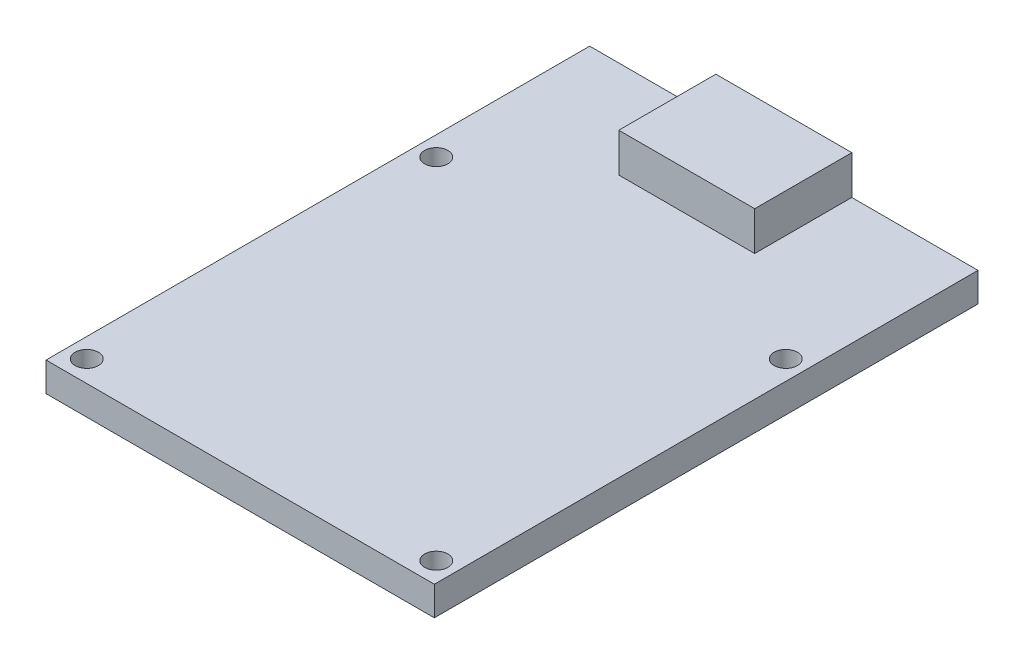
ISO-10303-21;
HEADER;
FILE_DESCRIPTION(('STEP AP214'),'2;1');
FILE_NAME('part.step','',(''),(''),'','','');
FILE_SCHEMA(('AUTOMOTIVE_DESIGN { 1 0 10303 214 1 1 1 1 }'));
ENDSEC;
DATA;
#1=APPLICATION_CONTEXT('core data for automotive mechanical design processes');
#2=APPLICATION_PROTOCOL_DEFINITION('international standard','automotive_design',2000,#1);
#3=PRODUCT_CONTEXT('',#1,'mechanical');
#4=PRODUCT('Part','Part','',(#3));
#5=PRODUCT_RELATED_PRODUCT_CATEGORY('part','',(#4));
#6=PRODUCT_DEFINITION_FORMATION('','',#4);
#7=PRODUCT_DEFINITION_CONTEXT('part definition',#1,'design');
#8=PRODUCT_DEFINITION('design','',#6,#7);
#9=PRODUCT_DEFINITION_SHAPE('','',#8);
#10=(LENGTH_UNIT() NAMED_UNIT(*) SI_UNIT(.MILLI.,.METRE.));
#11=(NAMED_UNIT(*) PLANE_ANGLE_UNIT() SI_UNIT($,.RADIAN.));
#12=(NAMED_UNIT(*) SI_UNIT($,.STERADIAN.) SOLID_ANGLE_UNIT());
#13=UNCERTAINTY_MEASURE_WITH_UNIT(LENGTH_MEASURE(1.E-05),#10,'distance_accuracy_value','');
#14=(GEOMETRIC_REPRESENTATION_CONTEXT(3) GLOBAL_UNCERTAINTY_ASSIGNED_CONTEXT((#13)) GLOBAL_UNIT_ASSIGNED_CONTEXT((#10,
#11,#12)) REPRESENTATION_CONTEXT('',''));
#15=CARTESIAN_POINT('',(0.,0.,0.));
#16=DIRECTION('',(0.,0.,1.));
#17=DIRECTION('',(1.,0.,0.));
#18=AXIS2_PLACEMENT_3D('',#15,#16,#17);
#19=CARTESIAN_POINT('',(0.,3.,0.));
#20=DIRECTION('',(0.,1.,0.));
#21=DIRECTION('',(0.,0.,1.));
#22=AXIS2_PLACEMENT_3D('',#19,#20,#21);
#23=PLANE('',#22);
#24=CARTESIAN_POINT('',(-18.,3.,-10.2));
#25=DIRECTION('',(0.,1.,0.));
#26=DIRECTION('',(0.,0.,1.));
#27=AXIS2_PLACEMENT_3D('',#24,#25,#26);
#28=CIRCLE('',#27,1.20000000000001);
#29=CARTESIAN_POINT('',(-18.,3.,-8.99999999999999));
#30=VERTEX_POINT('',#29);
#31=EDGE_CURVE('E125',#30,#30,#28,.T.);
#32=ORIENTED_EDGE('',*,*,#31,.F.);
#33=EDGE_LOOP('',(#32));
#34=FACE_BOUND('',#33,.T.);
#35=CARTESIAN_POINT('',(18.,3.,-10.2));
#36=DIRECTION('',(0.,1.,0.));
#37=DIRECTION('',(0.,0.,1.));
#38=AXIS2_PLACEMENT_3D('',#35,#36,#37);
#39=CIRCLE('',#38,1.20000000000001);
#40=CARTESIAN_POINT('',(18.,3.,-8.99999999999999));
#41=VERTEX_POINT('',#40);
#42=EDGE_CURVE('E136',#41,#41,#39,.T.);
#43=ORIENTED_EDGE('',*,*,#42,.F.);
#44=EDGE_LOOP('',(#43));
#45=FACE_BOUND('',#44,.T.);
#46=CARTESIAN_POINT('',(18.,3.,25.8));
#47=DIRECTION('',(0.,1.,0.));
#48=DIRECTION('',(0.,0.,1.));
#49=AXIS2_PLACEMENT_3D('',#46,#47,#48);
#50=CIRCLE('',#49,1.20000000000001);
#51=CARTESIAN_POINT('',(18.,3.,27.));
#52=VERTEX_POINT('',#51);
#53=EDGE_CURVE('E142',#52,#52,#50,.T.);
#54=ORIENTED_EDGE('',*,*,#53,.F.);
#55=EDGE_LOOP('',(#54));
#56=FACE_BOUND('',#55,.T.);
#57=CARTESIAN_POINT('',(-18.,3.,25.8));
#58=DIRECTION('',(0.,1.,0.));
#59=DIRECTION('',(0.,0.,1.));
#60=AXIS2_PLACEMENT_3D('',#57,#58,#59);
#61=CIRCLE('',#60,1.20000000000001);
#62=CARTESIAN_POINT('',(-18.,3.,27.));
#63=VERTEX_POINT('',#62);
#64=EDGE_CURVE('E148',#63,#63,#61,.T.);
#65=ORIENTED_EDGE('',*,*,#64,.F.);
#66=EDGE_LOOP('',(#65));
#67=FACE_BOUND('',#66,.T.);
#68=DIRECTION('',(1.,0.,0.));
#69=VECTOR('',#68,1.);
#70=CARTESIAN_POINT('',(0.,3.,-18.));
#71=LINE('',#70,#69);
#72=CARTESIAN_POINT('',(-7.,3.,-18.));
#73=VERTEX_POINT('',#72);
#74=CARTESIAN_POINT('',(7.,3.,-18.));
#75=VERTEX_POINT('',#74);
#76=EDGE_CURVE('E56',#73,#75,#71,.T.);
#77=ORIENTED_EDGE('',*,*,#76,.F.);
#78=DIRECTION('',(0.,0.,-1.));
#79=VECTOR('',#78,1.);
#80=CARTESIAN_POINT('',(-7.,3.,0.));
#81=LINE('',#80,#79);
#82=CARTESIAN_POINT('',(-7.,3.,-28.));
#83=VERTEX_POINT('',#82);
#84=EDGE_CURVE('E122',#73,#83,#81,.T.);
#85=ORIENTED_EDGE('',*,*,#84,.T.);
#86=DIRECTION('',(-1.,0.,0.));
#87=VECTOR('',#86,1.);
#88=CARTESIAN_POINT('',(-20.,3.,-28.));
#89=LINE('',#88,#87);
#90=CARTESIAN_POINT('',(-20.,3.,-28.));
#91=VERTEX_POINT('',#90);
#92=EDGE_CURVE('E158',#83,#91,#89,.T.);
#93=ORIENTED_EDGE('',*,*,#92,.T.);
#94=DIRECTION('',(0.,0.,1.));
#95=VECTOR('',#94,1.);
#96=CARTESIAN_POINT('',(-20.,3.,-28.));
#97=LINE('',#96,#95);
#98=CARTESIAN_POINT('',(-20.,3.,28.));
#99=VERTEX_POINT('',#98);
#100=EDGE_CURVE('E162',#91,#99,#97,.T.);
#101=ORIENTED_EDGE('',*,*,#100,.T.);
#102=DIRECTION('',(1.,0.,0.));
#103=VECTOR('',#102,1.);
#104=CARTESIAN_POINT('',(-20.,3.,28.));
#105=LINE('',#104,#103);
#106=CARTESIAN_POINT('',(20.,3.,28.));
#107=VERTEX_POINT('',#106);
#108=EDGE_CURVE('E164',#99,#107,#105,.T.);
#109=ORIENTED_EDGE('',*,*,#108,.T.);
#110=DIRECTION('',(0.,0.,-1.));
#111=VECTOR('',#110,1.);
#112=CARTESIAN_POINT('',(20.,3.,-28.));
#113=LINE('',#112,#111);
#114=CARTESIAN_POINT('',(20.,3.,-28.));
#115=VERTEX_POINT('',#114);
#116=EDGE_CURVE('E155',#107,#115,#113,.T.);
#117=ORIENTED_EDGE('',*,*,#116,.T.);
#118=CARTESIAN_POINT('',(7.,3.,-28.));
#119=VERTEX_POINT('',#118);
#120=EDGE_CURVE('E160',#115,#119,#89,.T.);
#121=ORIENTED_EDGE('',*,*,#120,.T.);
#122=DIRECTION('',(0.,0.,-1.));
#123=VECTOR('',#122,1.);
#124=CARTESIAN_POINT('',(7.,3.,0.));
#125=LINE('',#124,#123);
#126=EDGE_CURVE('E61',#75,#119,#125,.T.);
#127=ORIENTED_EDGE('',*,*,#126,.F.);
#128=EDGE_LOOP('',(#77,#85,#93,#101,#109,#117,#121,#127));
#129=FACE_BOUND('',#128,.T.);
#130=ADVANCED_FACE('F41',(#34,#45,#56,#67,#129),#23,.T.);
#131=CARTESIAN_POINT('',(20.,3.,-28.));
#132=DIRECTION('',(-1.,0.,0.));
#133=DIRECTION('',(0.,0.,1.));
#134=AXIS2_PLACEMENT_3D('',#131,#132,#133);
#135=PLANE('',#134);
#136=DIRECTION('',(0.,0.,-1.));
#137=VECTOR('',#136,1.);
#138=CARTESIAN_POINT('',(20.,0.,-28.));
#139=LINE('',#138,#137);
#140=CARTESIAN_POINT('',(20.,0.,28.));
#141=VERTEX_POINT('',#140);
#142=CARTESIAN_POINT('',(20.,0.,-28.));
#143=VERTEX_POINT('',#142);
#144=EDGE_CURVE('E154',#141,#143,#139,.T.);
#145=ORIENTED_EDGE('',*,*,#144,.T.);
#146=DIRECTION('',(0.,-1.,0.));
#147=VECTOR('',#146,1.);
#148=CARTESIAN_POINT('',(20.,3.,-28.));
#149=LINE('',#148,#147);
#150=EDGE_CURVE('E11',#115,#143,#149,.T.);
#151=ORIENTED_EDGE('',*,*,#150,.F.);
#152=ORIENTED_EDGE('',*,*,#116,.F.);
#153=DIRECTION('',(0.,-1.,0.));
#154=VECTOR('',#153,1.);
#155=CARTESIAN_POINT('',(20.,3.,28.));
#156=LINE('',#155,#154);
#157=EDGE_CURVE('E166',#107,#141,#156,.T.);
#158=ORIENTED_EDGE('',*,*,#157,.T.);
#159=EDGE_LOOP('',(#145,#151,#152,#158));
#160=FACE_BOUND('',#159,.T.);
#161=ADVANCED_FACE('F43',(#160),#135,.F.);
#162=CARTESIAN_POINT('',(-20.,3.,-28.));
#163=DIRECTION('',(0.,0.,1.));
#164=DIRECTION('',(1.,0.,0.));
#165=AXIS2_PLACEMENT_3D('',#162,#163,#164);
#166=PLANE('',#165);
#167=DIRECTION('',(-1.,0.,0.));
#168=VECTOR('',#167,1.);
#169=CARTESIAN_POINT('',(-20.,0.,-28.));
#170=LINE('',#169,#168);
#171=CARTESIAN_POINT('',(-20.,0.,-28.));
#172=VERTEX_POINT('',#171);
#173=EDGE_CURVE('E169',#143,#172,#170,.T.);
#174=ORIENTED_EDGE('',*,*,#173,.T.);
#175=DIRECTION('',(0.,-1.,0.));
#176=VECTOR('',#175,1.);
#177=CARTESIAN_POINT('',(-20.,3.,-28.));
#178=LINE('',#177,#176);
#179=EDGE_CURVE('E49',#91,#172,#178,.T.);
#180=ORIENTED_EDGE('',*,*,#179,.F.);
#181=ORIENTED_EDGE('',*,*,#92,.F.);
#182=DIRECTION('',(0.,-1.,0.));
#183=VECTOR('',#182,1.);
#184=CARTESIAN_POINT('',(-7.,7.,-28.));
#185=LINE('',#184,#183);
#186=CARTESIAN_POINT('',(-7.,7.,-28.));
#187=VERTEX_POINT('',#186);
#188=EDGE_CURVE('E130',#187,#83,#185,.T.);
#189=ORIENTED_EDGE('',*,*,#188,.F.);
#190=DIRECTION('',(-1.,0.,0.));
#191=VECTOR('',#190,1.);
#192=CARTESIAN_POINT('',(0.,7.,-28.));
#193=LINE('',#192,#191);
#194=CARTESIAN_POINT('',(7.,7.,-28.));
#195=VERTEX_POINT('',#194);
#196=EDGE_CURVE('E113',#195,#187,#193,.T.);
#197=ORIENTED_EDGE('',*,*,#196,.F.);
#198=DIRECTION('',(0.,-1.,0.));
#199=VECTOR('',#198,1.);
#200=CARTESIAN_POINT('',(7.,7.,-28.));
#201=LINE('',#200,#199);
#202=EDGE_CURVE('E110',#195,#119,#201,.T.);
#203=ORIENTED_EDGE('',*,*,#202,.T.);
#204=ORIENTED_EDGE('',*,*,#120,.F.);
#205=ORIENTED_EDGE('',*,*,#150,.T.);
#206=EDGE_LOOP('',(#174,#180,#181,#189,#197,#203,#204,#205));
#207=FACE_BOUND('',#206,.T.);
#208=ADVANCED_FACE('F201',(#207),#166,.F.);
#209=CARTESIAN_POINT('',(-20.,3.,-28.));
#210=DIRECTION('',(1.,0.,0.));
#211=DIRECTION('',(0.,0.,-1.));
#212=AXIS2_PLACEMENT_3D('',#209,#210,#211);
#213=PLANE('',#212);
#214=DIRECTION('',(0.,0.,1.));
#215=VECTOR('',#214,1.);
#216=CARTESIAN_POINT('',(-20.,0.,-28.));
#217=LINE('',#216,#215);
#218=CARTESIAN_POINT('',(-20.,0.,28.));
#219=VERTEX_POINT('',#218);
#220=EDGE_CURVE('E171',#172,#219,#217,.T.);
#221=ORIENTED_EDGE('',*,*,#220,.T.);
#222=DIRECTION('',(0.,-1.,0.));
#223=VECTOR('',#222,1.);
#224=CARTESIAN_POINT('',(-20.,3.,28.));
#225=LINE('',#224,#223);
#226=EDGE_CURVE('E176',#99,#219,#225,.T.);
#227=ORIENTED_EDGE('',*,*,#226,.F.);
#228=ORIENTED_EDGE('',*,*,#100,.F.);
#229=ORIENTED_EDGE('',*,*,#179,.T.);
#230=EDGE_LOOP('',(#221,#227,#228,#229));
#231=FACE_BOUND('',#230,.T.);
#232=ADVANCED_FACE('F183',(#231),#213,.F.);
#233=CARTESIAN_POINT('',(-20.,3.,28.));
#234=DIRECTION('',(0.,0.,-1.));
#235=DIRECTION('',(-1.,0.,0.));
#236=AXIS2_PLACEMENT_3D('',#233,#234,#235);
#237=PLANE('',#236);
#238=DIRECTION('',(1.,0.,0.));
#239=VECTOR('',#238,1.);
#240=CARTESIAN_POINT('',(-20.,0.,28.));
#241=LINE('',#240,#239);
#242=EDGE_CURVE('E159',#219,#141,#241,.T.);
#243=ORIENTED_EDGE('',*,*,#242,.T.);
#244=ORIENTED_EDGE('',*,*,#157,.F.);
#245=ORIENTED_EDGE('',*,*,#108,.F.);
#246=ORIENTED_EDGE('',*,*,#226,.T.);
#247=EDGE_LOOP('',(#243,#244,#245,#246));
#248=FACE_BOUND('',#247,.T.);
#249=ADVANCED_FACE('F193',(#248),#237,.F.);
#250=CARTESIAN_POINT('',(0.,0.,0.));
#251=DIRECTION('',(0.,1.,0.));
#252=DIRECTION('',(0.,0.,1.));
#253=AXIS2_PLACEMENT_3D('',#250,#251,#252);
#254=PLANE('',#253);
#255=CARTESIAN_POINT('',(-18.,0.,-10.2));
#256=DIRECTION('',(0.,1.,0.));
#257=DIRECTION('',(0.,0.,1.));
#258=AXIS2_PLACEMENT_3D('',#255,#256,#257);
#259=CIRCLE('',#258,1.20000000000001);
#260=CARTESIAN_POINT('',(-18.,0.,-8.99999999999999));
#261=VERTEX_POINT('',#260);
#262=EDGE_CURVE('E128',#261,#261,#259,.T.);
#263=ORIENTED_EDGE('',*,*,#262,.T.);
#264=EDGE_LOOP('',(#263));
#265=FACE_BOUND('',#264,.T.);
#266=CARTESIAN_POINT('',(18.,0.,-10.2));
#267=DIRECTION('',(0.,1.,0.));
#268=DIRECTION('',(0.,0.,1.));
#269=AXIS2_PLACEMENT_3D('',#266,#267,#268);
#270=CIRCLE('',#269,1.20000000000001);
#271=CARTESIAN_POINT('',(18.,0.,-8.99999999999999));
#272=VERTEX_POINT('',#271);
#273=EDGE_CURVE('E139',#272,#272,#270,.T.);
#274=ORIENTED_EDGE('',*,*,#273,.T.);
#275=EDGE_LOOP('',(#274));
#276=FACE_BOUND('',#275,.T.);
#277=CARTESIAN_POINT('',(18.,0.,25.8));
#278=DIRECTION('',(0.,1.,0.));
#279=DIRECTION('',(0.,0.,1.));
#280=AXIS2_PLACEMENT_3D('',#277,#278,#279);
#281=CIRCLE('',#280,1.20000000000001);
#282=CARTESIAN_POINT('',(18.,0.,27.));
#283=VERTEX_POINT('',#282);
#284=EDGE_CURVE('E145',#283,#283,#281,.T.);
#285=ORIENTED_EDGE('',*,*,#284,.T.);
#286=EDGE_LOOP('',(#285));
#287=FACE_BOUND('',#286,.T.);
#288=CARTESIAN_POINT('',(-18.,0.,25.8));
#289=DIRECTION('',(0.,1.,0.));
#290=DIRECTION('',(0.,0.,1.));
#291=AXIS2_PLACEMENT_3D('',#288,#289,#290);
#292=CIRCLE('',#291,1.20000000000001);
#293=CARTESIAN_POINT('',(-18.,0.,27.));
#294=VERTEX_POINT('',#293);
#295=EDGE_CURVE('E151',#294,#294,#292,.T.);
#296=ORIENTED_EDGE('',*,*,#295,.T.);
#297=EDGE_LOOP('',(#296));
#298=FACE_BOUND('',#297,.T.);
#299=ORIENTED_EDGE('',*,*,#144,.F.);
#300=ORIENTED_EDGE('',*,*,#242,.F.);
#301=ORIENTED_EDGE('',*,*,#220,.F.);
#302=ORIENTED_EDGE('',*,*,#173,.F.);
#303=EDGE_LOOP('',(#299,#300,#301,#302));
#304=FACE_BOUND('',#303,.T.);
#305=ADVANCED_FACE('F190',(#265,#276,#287,#298,#304),#254,.F.);
#306=CARTESIAN_POINT('',(-18.,3.,25.8));
#307=DIRECTION('',(0.,1.,0.));
#308=DIRECTION('',(0.,0.,1.));
#309=AXIS2_PLACEMENT_3D('',#306,#307,#308);
#310=CYLINDRICAL_SURFACE('',#309,1.20000000000001);
#311=ORIENTED_EDGE('',*,*,#295,.F.);
#312=EDGE_LOOP('',(#311));
#313=FACE_BOUND('',#312,.T.);
#314=ORIENTED_EDGE('',*,*,#64,.T.);
#315=EDGE_LOOP('',(#314));
#316=FACE_BOUND('',#315,.T.);
#317=ADVANCED_FACE('F231',(#313,#316),#310,.F.);
#318=CARTESIAN_POINT('',(18.,3.,25.8));
#319=DIRECTION('',(0.,1.,0.));
#320=DIRECTION('',(0.,0.,1.));
#321=AXIS2_PLACEMENT_3D('',#318,#319,#320);
#322=CYLINDRICAL_SURFACE('',#321,1.20000000000001);
#323=ORIENTED_EDGE('',*,*,#284,.F.);
#324=EDGE_LOOP('',(#323));
#325=FACE_BOUND('',#324,.T.);
#326=ORIENTED_EDGE('',*,*,#53,.T.);
#327=EDGE_LOOP('',(#326));
#328=FACE_BOUND('',#327,.T.);
#329=ADVANCED_FACE('F286',(#325,#328),#322,.F.);
#330=CARTESIAN_POINT('',(18.,3.,-10.2));
#331=DIRECTION('',(0.,1.,0.));
#332=DIRECTION('',(0.,0.,1.));
#333=AXIS2_PLACEMENT_3D('',#330,#331,#332);
#334=CYLINDRICAL_SURFACE('',#333,1.20000000000001);
#335=ORIENTED_EDGE('',*,*,#273,.F.);
#336=EDGE_LOOP('',(#335));
#337=FACE_BOUND('',#336,.T.);
#338=ORIENTED_EDGE('',*,*,#42,.T.);
#339=EDGE_LOOP('',(#338));
#340=FACE_BOUND('',#339,.T.);
#341=ADVANCED_FACE('F277',(#337,#340),#334,.F.);
#342=CARTESIAN_POINT('',(-18.,3.,-10.2));
#343=DIRECTION('',(0.,1.,0.));
#344=DIRECTION('',(0.,0.,1.));
#345=AXIS2_PLACEMENT_3D('',#342,#343,#344);
#346=CYLINDRICAL_SURFACE('',#345,1.20000000000001);
#347=ORIENTED_EDGE('',*,*,#262,.F.);
#348=EDGE_LOOP('',(#347));
#349=FACE_BOUND('',#348,.T.);
#350=ORIENTED_EDGE('',*,*,#31,.T.);
#351=EDGE_LOOP('',(#350));
#352=FACE_BOUND('',#351,.T.);
#353=ADVANCED_FACE('F247',(#349,#352),#346,.F.);
#354=CARTESIAN_POINT('',(0.,7.,-18.));
#355=DIRECTION('',(0.,0.,-1.));
#356=DIRECTION('',(-1.,0.,0.));
#357=AXIS2_PLACEMENT_3D('',#354,#355,#356);
#358=PLANE('',#357);
#359=ORIENTED_EDGE('',*,*,#76,.T.);
#360=DIRECTION('',(0.,-1.,0.));
#361=VECTOR('',#360,1.);
#362=CARTESIAN_POINT('',(7.,7.,-18.));
#363=LINE('',#362,#361);
#364=CARTESIAN_POINT('',(7.,7.,-18.));
#365=VERTEX_POINT('',#364);
#366=EDGE_CURVE('E108',#365,#75,#363,.T.);
#367=ORIENTED_EDGE('',*,*,#366,.F.);
#368=DIRECTION('',(1.,0.,0.));
#369=VECTOR('',#368,1.);
#370=CARTESIAN_POINT('',(0.,7.,-18.));
#371=LINE('',#370,#369);
#372=CARTESIAN_POINT('',(-7.,7.,-18.));
#373=VERTEX_POINT('',#372);
#374=EDGE_CURVE('E114',#373,#365,#371,.T.);
#375=ORIENTED_EDGE('',*,*,#374,.F.);
#376=DIRECTION('',(0.,-1.,0.));
#377=VECTOR('',#376,1.);
#378=CARTESIAN_POINT('',(-7.,7.,-18.));
#379=LINE('',#378,#377);
#380=EDGE_CURVE('E204',#373,#73,#379,.T.);
#381=ORIENTED_EDGE('',*,*,#380,.T.);
#382=EDGE_LOOP('',(#359,#367,#375,#381));
#383=FACE_BOUND('',#382,.T.);
#384=ADVANCED_FACE('F124',(#383),#358,.F.);
#385=CARTESIAN_POINT('',(7.,7.,0.));
#386=DIRECTION('',(-1.,0.,0.));
#387=DIRECTION('',(0.,0.,1.));
#388=AXIS2_PLACEMENT_3D('',#385,#386,#387);
#389=PLANE('',#388);
#390=ORIENTED_EDGE('',*,*,#126,.T.);
#391=ORIENTED_EDGE('',*,*,#202,.F.);
#392=DIRECTION('',(0.,0.,-1.));
#393=VECTOR('',#392,1.);
#394=CARTESIAN_POINT('',(7.,7.,0.));
#395=LINE('',#394,#393);
#396=EDGE_CURVE('E104',#365,#195,#395,.T.);
#397=ORIENTED_EDGE('',*,*,#396,.F.);
#398=ORIENTED_EDGE('',*,*,#366,.T.);
#399=EDGE_LOOP('',(#390,#391,#397,#398));
#400=FACE_BOUND('',#399,.T.);
#401=ADVANCED_FACE('F106',(#400),#389,.F.);
#402=CARTESIAN_POINT('',(-7.,7.,0.));
#403=DIRECTION('',(-1.,0.,0.));
#404=DIRECTION('',(0.,0.,1.));
#405=AXIS2_PLACEMENT_3D('',#402,#403,#404);
#406=PLANE('',#405);
#407=ORIENTED_EDGE('',*,*,#84,.F.);
#408=ORIENTED_EDGE('',*,*,#380,.F.);
#409=DIRECTION('',(0.,0.,-1.));
#410=VECTOR('',#409,1.);
#411=CARTESIAN_POINT('',(-7.,7.,0.));
#412=LINE('',#411,#410);
#413=EDGE_CURVE('E120',#373,#187,#412,.T.);
#414=ORIENTED_EDGE('',*,*,#413,.T.);
#415=ORIENTED_EDGE('',*,*,#188,.T.);
#416=EDGE_LOOP('',(#407,#408,#414,#415));
#417=FACE_BOUND('',#416,.T.);
#418=ADVANCED_FACE('F203',(#417),#406,.T.);
#419=CARTESIAN_POINT('',(0.,7.,0.));
#420=DIRECTION('',(0.,1.,0.));
#421=DIRECTION('',(0.,0.,1.));
#422=AXIS2_PLACEMENT_3D('',#419,#420,#421);
#423=PLANE('',#422);
#424=ORIENTED_EDGE('',*,*,#374,.T.);
#425=ORIENTED_EDGE('',*,*,#396,.T.);
#426=ORIENTED_EDGE('',*,*,#196,.T.);
#427=ORIENTED_EDGE('',*,*,#413,.F.);
#428=EDGE_LOOP('',(#424,#425,#426,#427));
#429=FACE_BOUND('',#428,.T.);
#430=ADVANCED_FACE('F118',(#429),#423,.T.);
#431=CLOSED_SHELL('',(#130,#161,#208,#232,#249,#305,#317,#329,#341,#353,#384,#401,#418,#430));
#432=MANIFOLD_SOLID_BREP('B2',#431);
#433=ADVANCED_BREP_SHAPE_REPRESENTATION('',(#18,#432),#14);
#434=SHAPE_DEFINITION_REPRESENTATION(#9,#433);
ENDSEC;
END-ISO-10303-21;
